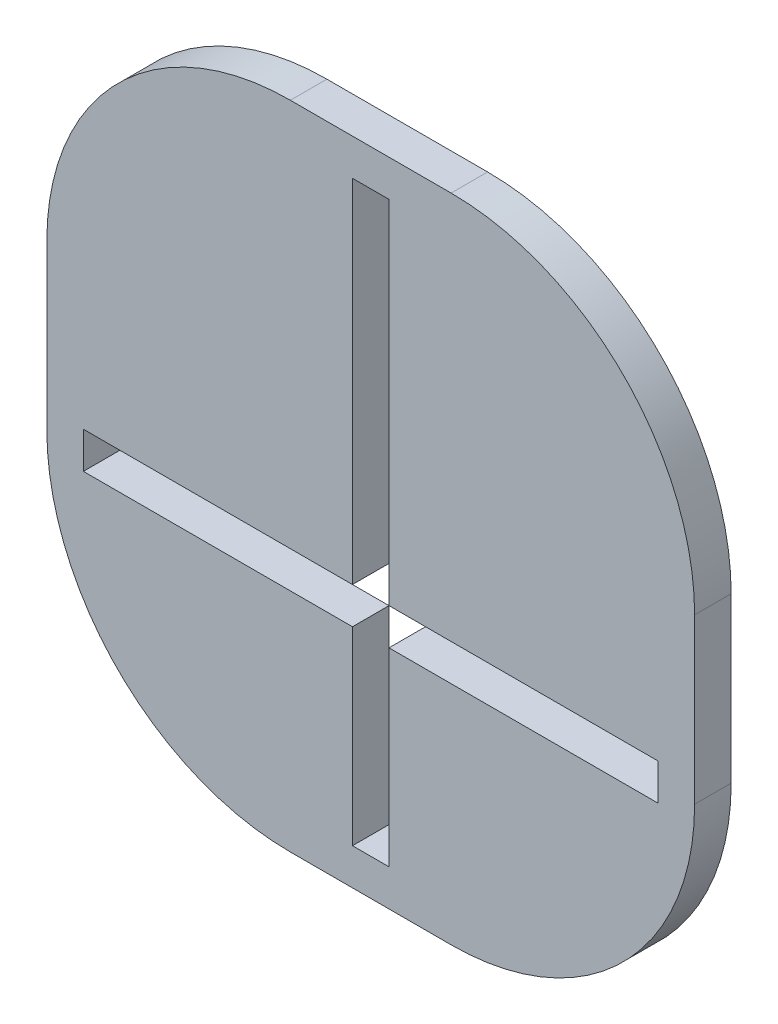
ISO-10303-21;
HEADER;
FILE_DESCRIPTION(('STEP AP214'),'2;1');
FILE_NAME('part.step','',(''),(''),'','','');
FILE_SCHEMA(('AUTOMOTIVE_DESIGN { 1 0 10303 214 1 1 1 1 }'));
ENDSEC;
DATA;
#1=APPLICATION_CONTEXT('core data for automotive mechanical design processes');
#2=APPLICATION_PROTOCOL_DEFINITION('international standard','automotive_design',2000,#1);
#3=PRODUCT_CONTEXT('',#1,'mechanical');
#4=PRODUCT('Part','Part','',(#3));
#5=PRODUCT_RELATED_PRODUCT_CATEGORY('part','',(#4));
#6=PRODUCT_DEFINITION_FORMATION('','',#4);
#7=PRODUCT_DEFINITION_CONTEXT('part definition',#1,'design');
#8=PRODUCT_DEFINITION('design','',#6,#7);
#9=PRODUCT_DEFINITION_SHAPE('','',#8);
#10=(LENGTH_UNIT() NAMED_UNIT(*) SI_UNIT(.MILLI.,.METRE.));
#11=(NAMED_UNIT(*) PLANE_ANGLE_UNIT() SI_UNIT($,.RADIAN.));
#12=(NAMED_UNIT(*) SI_UNIT($,.STERADIAN.) SOLID_ANGLE_UNIT());
#13=UNCERTAINTY_MEASURE_WITH_UNIT(LENGTH_MEASURE(1.E-05),#10,'distance_accuracy_value','');
#14=(GEOMETRIC_REPRESENTATION_CONTEXT(3) GLOBAL_UNCERTAINTY_ASSIGNED_CONTEXT((#13)) GLOBAL_UNIT_ASSIGNED_CONTEXT((#10,
#11,#12)) REPRESENTATION_CONTEXT('',''));
#15=CARTESIAN_POINT('',(0.,0.,0.));
#16=DIRECTION('',(0.,0.,1.));
#17=DIRECTION('',(1.,0.,0.));
#18=AXIS2_PLACEMENT_3D('',#15,#16,#17);
#19=CARTESIAN_POINT('',(0.,26.735,3.));
#20=DIRECTION('',(0.,-1.,0.));
#21=DIRECTION('',(1.,0.,0.));
#22=AXIS2_PLACEMENT_3D('',#19,#20,#21);
#23=PLANE('',#22);
#24=DIRECTION('',(-1.,0.,0.));
#25=VECTOR('',#24,1.);
#26=CARTESIAN_POINT('',(0.,26.735,0.));
#27=LINE('',#26,#25);
#28=CARTESIAN_POINT('',(6.6,26.735,0.));
#29=VERTEX_POINT('',#28);
#30=CARTESIAN_POINT('',(-6.60000000000003,26.735,0.));
#31=VERTEX_POINT('',#30);
#32=EDGE_CURVE('E254',#29,#31,#27,.T.);
#33=ORIENTED_EDGE('',*,*,#32,.T.);
#34=DIRECTION('',(0.,0.,-1.));
#35=VECTOR('',#34,1.);
#36=CARTESIAN_POINT('',(-6.60000000000003,26.735,3.));
#37=LINE('',#36,#35);
#38=CARTESIAN_POINT('',(-6.60000000000003,26.735,3.));
#39=VERTEX_POINT('',#38);
#40=EDGE_CURVE('E11',#39,#31,#37,.T.);
#41=ORIENTED_EDGE('',*,*,#40,.F.);
#42=DIRECTION('',(-1.,0.,0.));
#43=VECTOR('',#42,1.);
#44=CARTESIAN_POINT('',(0.,26.735,3.));
#45=LINE('',#44,#43);
#46=CARTESIAN_POINT('',(6.6,26.735,3.));
#47=VERTEX_POINT('',#46);
#48=EDGE_CURVE('E405',#47,#39,#45,.T.);
#49=ORIENTED_EDGE('',*,*,#48,.F.);
#50=DIRECTION('',(0.,0.,-1.));
#51=VECTOR('',#50,1.);
#52=CARTESIAN_POINT('',(6.6,26.735,3.));
#53=LINE('',#52,#51);
#54=EDGE_CURVE('E281',#47,#29,#53,.T.);
#55=ORIENTED_EDGE('',*,*,#54,.T.);
#56=EDGE_LOOP('',(#33,#41,#49,#55));
#57=FACE_BOUND('',#56,.T.);
#58=ADVANCED_FACE('F45',(#57),#23,.F.);
#59=CARTESIAN_POINT('',(-6.60000000000003,6.73500000000003,3.));
#60=DIRECTION('',(0.,0.,-1.));
#61=DIRECTION('',(-1.,0.,0.));
#62=AXIS2_PLACEMENT_3D('',#59,#60,#61);
#63=CYLINDRICAL_SURFACE('',#62,20.);
#64=CARTESIAN_POINT('',(-6.60000000000003,6.73500000000003,0.));
#65=DIRECTION('',(0.,0.,1.));
#66=DIRECTION('',(1.,0.,0.));
#67=AXIS2_PLACEMENT_3D('',#64,#65,#66);
#68=CIRCLE('',#67,20.);
#69=CARTESIAN_POINT('',(-26.6,6.73500000000002,0.));
#70=VERTEX_POINT('',#69);
#71=EDGE_CURVE('E258',#31,#70,#68,.T.);
#72=ORIENTED_EDGE('',*,*,#71,.T.);
#73=DIRECTION('',(0.,0.,-1.));
#74=VECTOR('',#73,1.);
#75=CARTESIAN_POINT('',(-26.6,6.73500000000002,3.));
#76=LINE('',#75,#74);
#77=CARTESIAN_POINT('',(-26.6,6.73500000000002,3.));
#78=VERTEX_POINT('',#77);
#79=EDGE_CURVE('E56',#78,#70,#76,.T.);
#80=ORIENTED_EDGE('',*,*,#79,.F.);
#81=CARTESIAN_POINT('',(-6.60000000000003,6.73500000000003,3.));
#82=DIRECTION('',(0.,0.,1.));
#83=DIRECTION('',(1.,0.,0.));
#84=AXIS2_PLACEMENT_3D('',#81,#82,#83);
#85=CIRCLE('',#84,20.);
#86=EDGE_CURVE('E408',#39,#78,#85,.T.);
#87=ORIENTED_EDGE('',*,*,#86,.F.);
#88=ORIENTED_EDGE('',*,*,#40,.T.);
#89=EDGE_LOOP('',(#72,#80,#87,#88));
#90=FACE_BOUND('',#89,.T.);
#91=ADVANCED_FACE('F440',(#90),#63,.T.);
#92=CARTESIAN_POINT('',(-26.6,0.,3.));
#93=DIRECTION('',(-1.,0.,0.));
#94=DIRECTION('',(0.,-1.,0.));
#95=AXIS2_PLACEMENT_3D('',#92,#93,#94);
#96=PLANE('',#95);
#97=DIRECTION('',(0.,1.,0.));
#98=VECTOR('',#97,1.);
#99=CARTESIAN_POINT('',(-26.6,0.,0.));
#100=LINE('',#99,#98);
#101=CARTESIAN_POINT('',(-26.6,-6.73500000000001,0.));
#102=VERTEX_POINT('',#101);
#103=EDGE_CURVE('E262',#102,#70,#100,.T.);
#104=ORIENTED_EDGE('',*,*,#103,.F.);
#105=DIRECTION('',(0.,0.,-1.));
#106=VECTOR('',#105,1.);
#107=CARTESIAN_POINT('',(-26.6,-6.73500000000001,3.));
#108=LINE('',#107,#106);
#109=CARTESIAN_POINT('',(-26.6,-6.73500000000001,3.));
#110=VERTEX_POINT('',#109);
#111=EDGE_CURVE('E291',#110,#102,#108,.T.);
#112=ORIENTED_EDGE('',*,*,#111,.F.);
#113=DIRECTION('',(0.,1.,0.));
#114=VECTOR('',#113,1.);
#115=CARTESIAN_POINT('',(-26.6,0.,3.));
#116=LINE('',#115,#114);
#117=EDGE_CURVE('E411',#110,#78,#116,.T.);
#118=ORIENTED_EDGE('',*,*,#117,.T.);
#119=ORIENTED_EDGE('',*,*,#79,.T.);
#120=EDGE_LOOP('',(#104,#112,#118,#119));
#121=FACE_BOUND('',#120,.T.);
#122=ADVANCED_FACE('F445',(#121),#96,.T.);
#123=CARTESIAN_POINT('',(-6.60000000000002,-6.735,3.));
#124=DIRECTION('',(0.,0.,-1.));
#125=DIRECTION('',(-1.,0.,0.));
#126=AXIS2_PLACEMENT_3D('',#123,#124,#125);
#127=CYLINDRICAL_SURFACE('',#126,20.);
#128=CARTESIAN_POINT('',(-6.60000000000002,-6.735,0.));
#129=DIRECTION('',(0.,0.,1.));
#130=DIRECTION('',(1.,0.,0.));
#131=AXIS2_PLACEMENT_3D('',#128,#129,#130);
#132=CIRCLE('',#131,20.);
#133=CARTESIAN_POINT('',(-6.60000000000002,-26.735,0.));
#134=VERTEX_POINT('',#133);
#135=EDGE_CURVE('E266',#134,#102,#132,.F.);
#136=ORIENTED_EDGE('',*,*,#135,.F.);
#137=DIRECTION('',(0.,0.,-1.));
#138=VECTOR('',#137,1.);
#139=CARTESIAN_POINT('',(-6.60000000000002,-26.735,3.));
#140=LINE('',#139,#138);
#141=CARTESIAN_POINT('',(-6.60000000000002,-26.735,3.));
#142=VERTEX_POINT('',#141);
#143=EDGE_CURVE('E288',#142,#134,#140,.T.);
#144=ORIENTED_EDGE('',*,*,#143,.F.);
#145=CARTESIAN_POINT('',(-6.60000000000002,-6.735,3.));
#146=DIRECTION('',(0.,0.,1.));
#147=DIRECTION('',(1.,0.,0.));
#148=AXIS2_PLACEMENT_3D('',#145,#146,#147);
#149=CIRCLE('',#148,20.);
#150=EDGE_CURVE('E415',#142,#110,#149,.F.);
#151=ORIENTED_EDGE('',*,*,#150,.T.);
#152=ORIENTED_EDGE('',*,*,#111,.T.);
#153=EDGE_LOOP('',(#136,#144,#151,#152));
#154=FACE_BOUND('',#153,.T.);
#155=ADVANCED_FACE('F608',(#154),#127,.T.);
#156=CARTESIAN_POINT('',(0.,-26.735,3.));
#157=DIRECTION('',(0.,-1.,0.));
#158=DIRECTION('',(1.,0.,0.));
#159=AXIS2_PLACEMENT_3D('',#156,#157,#158);
#160=PLANE('',#159);
#161=DIRECTION('',(-1.,0.,0.));
#162=VECTOR('',#161,1.);
#163=CARTESIAN_POINT('',(0.,-26.735,0.));
#164=LINE('',#163,#162);
#165=CARTESIAN_POINT('',(6.60000000000001,-26.735,0.));
#166=VERTEX_POINT('',#165);
#167=EDGE_CURVE('E270',#166,#134,#164,.T.);
#168=ORIENTED_EDGE('',*,*,#167,.F.);
#169=DIRECTION('',(0.,0.,-1.));
#170=VECTOR('',#169,1.);
#171=CARTESIAN_POINT('',(6.60000000000001,-26.735,3.));
#172=LINE('',#171,#170);
#173=CARTESIAN_POINT('',(6.60000000000001,-26.735,3.));
#174=VERTEX_POINT('',#173);
#175=EDGE_CURVE('E212',#174,#166,#172,.T.);
#176=ORIENTED_EDGE('',*,*,#175,.F.);
#177=DIRECTION('',(-1.,0.,0.));
#178=VECTOR('',#177,1.);
#179=CARTESIAN_POINT('',(0.,-26.735,3.));
#180=LINE('',#179,#178);
#181=EDGE_CURVE('E203',#174,#142,#180,.T.);
#182=ORIENTED_EDGE('',*,*,#181,.T.);
#183=ORIENTED_EDGE('',*,*,#143,.T.);
#184=EDGE_LOOP('',(#168,#176,#182,#183));
#185=FACE_BOUND('',#184,.T.);
#186=ADVANCED_FACE('F421',(#185),#160,.T.);
#187=CARTESIAN_POINT('',(6.6,-6.735,3.));
#188=DIRECTION('',(0.,0.,-1.));
#189=DIRECTION('',(-1.,0.,0.));
#190=AXIS2_PLACEMENT_3D('',#187,#188,#189);
#191=CYLINDRICAL_SURFACE('',#190,20.);
#192=CARTESIAN_POINT('',(6.6,-6.735,0.));
#193=DIRECTION('',(0.,0.,1.));
#194=DIRECTION('',(1.,0.,0.));
#195=AXIS2_PLACEMENT_3D('',#192,#193,#194);
#196=CIRCLE('',#195,20.);
#197=CARTESIAN_POINT('',(26.6,-6.735,0.));
#198=VERTEX_POINT('',#197);
#199=EDGE_CURVE('E210',#166,#198,#196,.T.);
#200=ORIENTED_EDGE('',*,*,#199,.T.);
#201=DIRECTION('',(0.,0.,-1.));
#202=VECTOR('',#201,1.);
#203=CARTESIAN_POINT('',(26.6,-6.735,3.));
#204=LINE('',#203,#202);
#205=CARTESIAN_POINT('',(26.6,-6.735,3.));
#206=VERTEX_POINT('',#205);
#207=EDGE_CURVE('E207',#206,#198,#204,.T.);
#208=ORIENTED_EDGE('',*,*,#207,.F.);
#209=CARTESIAN_POINT('',(6.6,-6.735,3.));
#210=DIRECTION('',(0.,0.,1.));
#211=DIRECTION('',(1.,0.,0.));
#212=AXIS2_PLACEMENT_3D('',#209,#210,#211);
#213=CIRCLE('',#212,20.);
#214=EDGE_CURVE('E196',#174,#206,#213,.T.);
#215=ORIENTED_EDGE('',*,*,#214,.F.);
#216=ORIENTED_EDGE('',*,*,#175,.T.);
#217=EDGE_LOOP('',(#200,#208,#215,#216));
#218=FACE_BOUND('',#217,.T.);
#219=ADVANCED_FACE('F208',(#218),#191,.T.);
#220=CARTESIAN_POINT('',(26.6,0.,3.));
#221=DIRECTION('',(-1.,0.,0.));
#222=DIRECTION('',(0.,0.,1.));
#223=AXIS2_PLACEMENT_3D('',#220,#221,#222);
#224=PLANE('',#223);
#225=DIRECTION('',(0.,1.,0.));
#226=VECTOR('',#225,1.);
#227=CARTESIAN_POINT('',(26.6,0.,0.));
#228=LINE('',#227,#226);
#229=CARTESIAN_POINT('',(26.6,6.73500000000003,0.));
#230=VERTEX_POINT('',#229);
#231=EDGE_CURVE('E130',#198,#230,#228,.T.);
#232=ORIENTED_EDGE('',*,*,#231,.T.);
#233=DIRECTION('',(0.,0.,-1.));
#234=VECTOR('',#233,1.);
#235=CARTESIAN_POINT('',(26.6,6.73500000000003,3.));
#236=LINE('',#235,#234);
#237=CARTESIAN_POINT('',(26.6,6.73500000000003,3.));
#238=VERTEX_POINT('',#237);
#239=EDGE_CURVE('E213',#238,#230,#236,.T.);
#240=ORIENTED_EDGE('',*,*,#239,.F.);
#241=DIRECTION('',(0.,1.,0.));
#242=VECTOR('',#241,1.);
#243=CARTESIAN_POINT('',(26.6,0.,3.));
#244=LINE('',#243,#242);
#245=EDGE_CURVE('E200',#206,#238,#244,.T.);
#246=ORIENTED_EDGE('',*,*,#245,.F.);
#247=ORIENTED_EDGE('',*,*,#207,.T.);
#248=EDGE_LOOP('',(#232,#240,#246,#247));
#249=FACE_BOUND('',#248,.T.);
#250=ADVANCED_FACE('F215',(#249),#224,.F.);
#251=CARTESIAN_POINT('',(0.,23.735,3.));
#252=DIRECTION('',(0.,1.,0.));
#253=DIRECTION('',(0.,0.,1.));
#254=AXIS2_PLACEMENT_3D('',#251,#252,#253);
#255=PLANE('',#254);
#256=DIRECTION('',(1.,0.,0.));
#257=VECTOR('',#256,1.);
#258=CARTESIAN_POINT('',(0.,23.735,0.));
#259=LINE('',#258,#257);
#260=CARTESIAN_POINT('',(-1.50000000000001,23.735,0.));
#261=VERTEX_POINT('',#260);
#262=CARTESIAN_POINT('',(1.50000000000001,23.735,0.));
#263=VERTEX_POINT('',#262);
#264=EDGE_CURVE('E223',#261,#263,#259,.T.);
#265=ORIENTED_EDGE('',*,*,#264,.T.);
#266=DIRECTION('',(0.,0.,-1.));
#267=VECTOR('',#266,1.);
#268=CARTESIAN_POINT('',(1.50000000000001,23.735,3.));
#269=LINE('',#268,#267);
#270=CARTESIAN_POINT('',(1.50000000000001,23.735,3.));
#271=VERTEX_POINT('',#270);
#272=EDGE_CURVE('E49',#271,#263,#269,.T.);
#273=ORIENTED_EDGE('',*,*,#272,.F.);
#274=DIRECTION('',(1.,0.,0.));
#275=VECTOR('',#274,1.);
#276=CARTESIAN_POINT('',(0.,23.735,3.));
#277=LINE('',#276,#275);
#278=CARTESIAN_POINT('',(-1.50000000000001,23.735,3.));
#279=VERTEX_POINT('',#278);
#280=EDGE_CURVE('E280',#279,#271,#277,.T.);
#281=ORIENTED_EDGE('',*,*,#280,.F.);
#282=DIRECTION('',(0.,0.,-1.));
#283=VECTOR('',#282,1.);
#284=CARTESIAN_POINT('',(-1.50000000000001,23.735,3.));
#285=LINE('',#284,#283);
#286=EDGE_CURVE('E219',#279,#261,#285,.T.);
#287=ORIENTED_EDGE('',*,*,#286,.T.);
#288=EDGE_LOOP('',(#265,#273,#281,#287));
#289=FACE_BOUND('',#288,.T.);
#290=ADVANCED_FACE('F47',(#289),#255,.F.);
#291=CARTESIAN_POINT('',(1.50000000000001,0.,3.));
#292=DIRECTION('',(1.,0.,0.));
#293=DIRECTION('',(0.,0.,-1.));
#294=AXIS2_PLACEMENT_3D('',#291,#292,#293);
#295=PLANE('',#294);
#296=DIRECTION('',(0.,-1.,0.));
#297=VECTOR('',#296,1.);
#298=CARTESIAN_POINT('',(1.50000000000001,0.,0.));
#299=LINE('',#298,#297);
#300=CARTESIAN_POINT('',(1.50000000000001,-5.16,0.));
#301=VERTEX_POINT('',#300);
#302=EDGE_CURVE('E227',#263,#301,#299,.T.);
#303=ORIENTED_EDGE('',*,*,#302,.T.);
#304=DIRECTION('',(0.,0.,-1.));
#305=VECTOR('',#304,1.);
#306=CARTESIAN_POINT('',(1.50000000000001,-5.16,3.));
#307=LINE('',#306,#305);
#308=CARTESIAN_POINT('',(1.50000000000001,-5.16,3.));
#309=VERTEX_POINT('',#308);
#310=EDGE_CURVE('E329',#309,#301,#307,.T.);
#311=ORIENTED_EDGE('',*,*,#310,.F.);
#312=DIRECTION('',(0.,-1.,0.));
#313=VECTOR('',#312,1.);
#314=CARTESIAN_POINT('',(1.50000000000001,0.,3.));
#315=LINE('',#314,#313);
#316=EDGE_CURVE('E145',#271,#309,#315,.T.);
#317=ORIENTED_EDGE('',*,*,#316,.F.);
#318=ORIENTED_EDGE('',*,*,#272,.T.);
#319=EDGE_LOOP('',(#303,#311,#317,#318));
#320=FACE_BOUND('',#319,.T.);
#321=ADVANCED_FACE('F337',(#320),#295,.F.);
#322=CARTESIAN_POINT('',(0.,-5.16,3.));
#323=DIRECTION('',(0.,1.,0.));
#324=DIRECTION('',(0.,0.,1.));
#325=AXIS2_PLACEMENT_3D('',#322,#323,#324);
#326=PLANE('',#325);
#327=DIRECTION('',(1.,0.,0.));
#328=VECTOR('',#327,1.);
#329=CARTESIAN_POINT('',(0.,-5.16,0.));
#330=LINE('',#329,#328);
#331=CARTESIAN_POINT('',(23.6,-5.16,0.));
#332=VERTEX_POINT('',#331);
#333=EDGE_CURVE('E230',#301,#332,#330,.T.);
#334=ORIENTED_EDGE('',*,*,#333,.T.);
#335=DIRECTION('',(0.,0.,-1.));
#336=VECTOR('',#335,1.);
#337=CARTESIAN_POINT('',(23.6,-5.16,3.));
#338=LINE('',#337,#336);
#339=CARTESIAN_POINT('',(23.6,-5.16,3.));
#340=VERTEX_POINT('',#339);
#341=EDGE_CURVE('E326',#340,#332,#338,.T.);
#342=ORIENTED_EDGE('',*,*,#341,.F.);
#343=DIRECTION('',(1.,0.,0.));
#344=VECTOR('',#343,1.);
#345=CARTESIAN_POINT('',(0.,-5.16,3.));
#346=LINE('',#345,#344);
#347=EDGE_CURVE('E477',#309,#340,#346,.T.);
#348=ORIENTED_EDGE('',*,*,#347,.F.);
#349=ORIENTED_EDGE('',*,*,#310,.T.);
#350=EDGE_LOOP('',(#334,#342,#348,#349));
#351=FACE_BOUND('',#350,.T.);
#352=ADVANCED_FACE('F452',(#351),#326,.F.);
#353=CARTESIAN_POINT('',(23.6,0.,3.));
#354=DIRECTION('',(1.,0.,0.));
#355=DIRECTION('',(0.,0.,-1.));
#356=AXIS2_PLACEMENT_3D('',#353,#354,#355);
#357=PLANE('',#356);
#358=DIRECTION('',(0.,-1.,0.));
#359=VECTOR('',#358,1.);
#360=CARTESIAN_POINT('',(23.6,0.,0.));
#361=LINE('',#360,#359);
#362=CARTESIAN_POINT('',(23.6,-8.16000000000001,0.));
#363=VERTEX_POINT('',#362);
#364=EDGE_CURVE('E234',#332,#363,#361,.T.);
#365=ORIENTED_EDGE('',*,*,#364,.T.);
#366=DIRECTION('',(0.,0.,-1.));
#367=VECTOR('',#366,1.);
#368=CARTESIAN_POINT('',(23.6,-8.16000000000001,3.));
#369=LINE('',#368,#367);
#370=CARTESIAN_POINT('',(23.6,-8.16000000000001,3.));
#371=VERTEX_POINT('',#370);
#372=EDGE_CURVE('E322',#371,#363,#369,.T.);
#373=ORIENTED_EDGE('',*,*,#372,.F.);
#374=DIRECTION('',(0.,-1.,0.));
#375=VECTOR('',#374,1.);
#376=CARTESIAN_POINT('',(23.6,0.,3.));
#377=LINE('',#376,#375);
#378=EDGE_CURVE('E475',#340,#371,#377,.T.);
#379=ORIENTED_EDGE('',*,*,#378,.F.);
#380=ORIENTED_EDGE('',*,*,#341,.T.);
#381=EDGE_LOOP('',(#365,#373,#379,#380));
#382=FACE_BOUND('',#381,.T.);
#383=ADVANCED_FACE('F461',(#382),#357,.F.);
#384=CARTESIAN_POINT('',(0.,-8.16000000000001,3.));
#385=DIRECTION('',(0.,-1.,0.));
#386=DIRECTION('',(0.,0.,-1.));
#387=AXIS2_PLACEMENT_3D('',#384,#385,#386);
#388=PLANE('',#387);
#389=DIRECTION('',(-1.,0.,0.));
#390=VECTOR('',#389,1.);
#391=CARTESIAN_POINT('',(0.,-8.16000000000001,0.));
#392=LINE('',#391,#390);
#393=CARTESIAN_POINT('',(1.50000000000001,-8.16000000000001,0.));
#394=VERTEX_POINT('',#393);
#395=EDGE_CURVE('E238',#363,#394,#392,.T.);
#396=ORIENTED_EDGE('',*,*,#395,.T.);
#397=DIRECTION('',(0.,0.,-1.));
#398=VECTOR('',#397,1.);
#399=CARTESIAN_POINT('',(1.50000000000001,-8.16000000000001,3.));
#400=LINE('',#399,#398);
#401=CARTESIAN_POINT('',(1.50000000000001,-8.16000000000001,3.));
#402=VERTEX_POINT('',#401);
#403=EDGE_CURVE('E318',#402,#394,#400,.T.);
#404=ORIENTED_EDGE('',*,*,#403,.F.);
#405=DIRECTION('',(-1.,0.,0.));
#406=VECTOR('',#405,1.);
#407=CARTESIAN_POINT('',(0.,-8.16000000000001,3.));
#408=LINE('',#407,#406);
#409=EDGE_CURVE('E397',#371,#402,#408,.T.);
#410=ORIENTED_EDGE('',*,*,#409,.F.);
#411=ORIENTED_EDGE('',*,*,#372,.T.);
#412=EDGE_LOOP('',(#396,#404,#410,#411));
#413=FACE_BOUND('',#412,.T.);
#414=ADVANCED_FACE('F457',(#413),#388,.F.);
#415=CARTESIAN_POINT('',(1.50000000000001,-23.735,0.));
#416=VERTEX_POINT('',#415);
#417=EDGE_CURVE('E231',#394,#416,#299,.T.);
#418=ORIENTED_EDGE('',*,*,#417,.T.);
#419=DIRECTION('',(0.,0.,-1.));
#420=VECTOR('',#419,1.);
#421=CARTESIAN_POINT('',(1.50000000000001,-23.735,3.));
#422=LINE('',#421,#420);
#423=CARTESIAN_POINT('',(1.50000000000001,-23.735,3.));
#424=VERTEX_POINT('',#423);
#425=EDGE_CURVE('E315',#424,#416,#422,.T.);
#426=ORIENTED_EDGE('',*,*,#425,.F.);
#427=EDGE_CURVE('E391',#402,#424,#315,.T.);
#428=ORIENTED_EDGE('',*,*,#427,.F.);
#429=ORIENTED_EDGE('',*,*,#403,.T.);
#430=EDGE_LOOP('',(#418,#426,#428,#429));
#431=FACE_BOUND('',#430,.T.);
#432=ADVANCED_FACE('F377',(#431),#295,.F.);
#433=CARTESIAN_POINT('',(0.,-23.735,3.));
#434=DIRECTION('',(0.,1.,0.));
#435=DIRECTION('',(0.,0.,1.));
#436=AXIS2_PLACEMENT_3D('',#433,#434,#435);
#437=PLANE('',#436);
#438=DIRECTION('',(1.,0.,0.));
#439=VECTOR('',#438,1.);
#440=CARTESIAN_POINT('',(0.,-23.735,0.));
#441=LINE('',#440,#439);
#442=CARTESIAN_POINT('',(-1.50000000000001,-23.735,0.));
#443=VERTEX_POINT('',#442);
#444=EDGE_CURVE('E242',#443,#416,#441,.T.);
#445=ORIENTED_EDGE('',*,*,#444,.F.);
#446=DIRECTION('',(0.,0.,-1.));
#447=VECTOR('',#446,1.);
#448=CARTESIAN_POINT('',(-1.50000000000001,-23.735,3.));
#449=LINE('',#448,#447);
#450=CARTESIAN_POINT('',(-1.50000000000001,-23.735,3.));
#451=VERTEX_POINT('',#450);
#452=EDGE_CURVE('E312',#451,#443,#449,.T.);
#453=ORIENTED_EDGE('',*,*,#452,.F.);
#454=DIRECTION('',(1.,0.,0.));
#455=VECTOR('',#454,1.);
#456=CARTESIAN_POINT('',(0.,-23.735,3.));
#457=LINE('',#456,#455);
#458=EDGE_CURVE('E386',#451,#424,#457,.T.);
#459=ORIENTED_EDGE('',*,*,#458,.T.);
#460=ORIENTED_EDGE('',*,*,#425,.T.);
#461=EDGE_LOOP('',(#445,#453,#459,#460));
#462=FACE_BOUND('',#461,.T.);
#463=ADVANCED_FACE('F384',(#462),#437,.T.);
#464=CARTESIAN_POINT('',(-1.50000000000001,0.,3.));
#465=DIRECTION('',(1.,0.,0.));
#466=DIRECTION('',(0.,0.,-1.));
#467=AXIS2_PLACEMENT_3D('',#464,#465,#466);
#468=PLANE('',#467);
#469=DIRECTION('',(0.,-1.,0.));
#470=VECTOR('',#469,1.);
#471=CARTESIAN_POINT('',(-1.50000000000001,0.,0.));
#472=LINE('',#471,#470);
#473=CARTESIAN_POINT('',(-1.50000000000001,-8.16000000000001,0.));
#474=VERTEX_POINT('',#473);
#475=EDGE_CURVE('E246',#474,#443,#472,.T.);
#476=ORIENTED_EDGE('',*,*,#475,.F.);
#477=DIRECTION('',(0.,0.,-1.));
#478=VECTOR('',#477,1.);
#479=CARTESIAN_POINT('',(-1.50000000000001,-8.16000000000001,3.));
#480=LINE('',#479,#478);
#481=CARTESIAN_POINT('',(-1.50000000000001,-8.16000000000001,3.));
#482=VERTEX_POINT('',#481);
#483=EDGE_CURVE('E309',#482,#474,#480,.T.);
#484=ORIENTED_EDGE('',*,*,#483,.F.);
#485=DIRECTION('',(0.,-1.,0.));
#486=VECTOR('',#485,1.);
#487=CARTESIAN_POINT('',(-1.50000000000001,0.,3.));
#488=LINE('',#487,#486);
#489=EDGE_CURVE('E390',#482,#451,#488,.T.);
#490=ORIENTED_EDGE('',*,*,#489,.T.);
#491=ORIENTED_EDGE('',*,*,#452,.T.);
#492=EDGE_LOOP('',(#476,#484,#490,#491));
#493=FACE_BOUND('',#492,.T.);
#494=ADVANCED_FACE('F436',(#493),#468,.T.);
#495=CARTESIAN_POINT('',(-23.6,-8.16000000000001,0.));
#496=VERTEX_POINT('',#495);
#497=EDGE_CURVE('E241',#474,#496,#392,.T.);
#498=ORIENTED_EDGE('',*,*,#497,.T.);
#499=DIRECTION('',(0.,0.,-1.));
#500=VECTOR('',#499,1.);
#501=CARTESIAN_POINT('',(-23.6,-8.16000000000001,3.));
#502=LINE('',#501,#500);
#503=CARTESIAN_POINT('',(-23.6,-8.16000000000001,3.));
#504=VERTEX_POINT('',#503);
#505=EDGE_CURVE('E305',#504,#496,#502,.T.);
#506=ORIENTED_EDGE('',*,*,#505,.F.);
#507=EDGE_CURVE('E369',#482,#504,#408,.T.);
#508=ORIENTED_EDGE('',*,*,#507,.F.);
#509=ORIENTED_EDGE('',*,*,#483,.T.);
#510=EDGE_LOOP('',(#498,#506,#508,#509));
#511=FACE_BOUND('',#510,.T.);
#512=ADVANCED_FACE('F368',(#511),#388,.F.);
#513=CARTESIAN_POINT('',(-23.6,0.,3.));
#514=DIRECTION('',(-1.,0.,0.));
#515=DIRECTION('',(0.,0.,1.));
#516=AXIS2_PLACEMENT_3D('',#513,#514,#515);
#517=PLANE('',#516);
#518=DIRECTION('',(0.,1.,0.));
#519=VECTOR('',#518,1.);
#520=CARTESIAN_POINT('',(-23.6,0.,0.));
#521=LINE('',#520,#519);
#522=CARTESIAN_POINT('',(-23.6,-5.16,0.));
#523=VERTEX_POINT('',#522);
#524=EDGE_CURVE('E251',#496,#523,#521,.T.);
#525=ORIENTED_EDGE('',*,*,#524,.T.);
#526=DIRECTION('',(0.,0.,-1.));
#527=VECTOR('',#526,1.);
#528=CARTESIAN_POINT('',(-23.6,-5.16,3.));
#529=LINE('',#528,#527);
#530=CARTESIAN_POINT('',(-23.6,-5.16,3.));
#531=VERTEX_POINT('',#530);
#532=EDGE_CURVE('E301',#531,#523,#529,.T.);
#533=ORIENTED_EDGE('',*,*,#532,.F.);
#534=DIRECTION('',(0.,1.,0.));
#535=VECTOR('',#534,1.);
#536=CARTESIAN_POINT('',(-23.6,0.,3.));
#537=LINE('',#536,#535);
#538=EDGE_CURVE('E365',#504,#531,#537,.T.);
#539=ORIENTED_EDGE('',*,*,#538,.F.);
#540=ORIENTED_EDGE('',*,*,#505,.T.);
#541=EDGE_LOOP('',(#525,#533,#539,#540));
#542=FACE_BOUND('',#541,.T.);
#543=ADVANCED_FACE('F362',(#542),#517,.F.);
#544=CARTESIAN_POINT('',(-1.50000000000001,-5.16,0.));
#545=VERTEX_POINT('',#544);
#546=EDGE_CURVE('E235',#523,#545,#330,.T.);
#547=ORIENTED_EDGE('',*,*,#546,.T.);
#548=DIRECTION('',(0.,0.,-1.));
#549=VECTOR('',#548,1.);
#550=CARTESIAN_POINT('',(-1.50000000000001,-5.16,3.));
#551=LINE('',#550,#549);
#552=CARTESIAN_POINT('',(-1.50000000000001,-5.16,3.));
#553=VERTEX_POINT('',#552);
#554=EDGE_CURVE('E298',#553,#545,#551,.T.);
#555=ORIENTED_EDGE('',*,*,#554,.F.);
#556=EDGE_CURVE('E404',#531,#553,#346,.T.);
#557=ORIENTED_EDGE('',*,*,#556,.F.);
#558=ORIENTED_EDGE('',*,*,#532,.T.);
#559=EDGE_LOOP('',(#547,#555,#557,#558));
#560=FACE_BOUND('',#559,.T.);
#561=ADVANCED_FACE('F355',(#560),#326,.F.);
#562=EDGE_CURVE('E250',#261,#545,#472,.T.);
#563=ORIENTED_EDGE('',*,*,#562,.F.);
#564=ORIENTED_EDGE('',*,*,#286,.F.);
#565=EDGE_CURVE('E396',#279,#553,#488,.T.);
#566=ORIENTED_EDGE('',*,*,#565,.T.);
#567=ORIENTED_EDGE('',*,*,#554,.T.);
#568=EDGE_LOOP('',(#563,#564,#566,#567));
#569=FACE_BOUND('',#568,.T.);
#570=ADVANCED_FACE('F348',(#569),#468,.T.);
#571=CARTESIAN_POINT('',(6.6,6.73500000000003,3.));
#572=DIRECTION('',(0.,0.,-1.));
#573=DIRECTION('',(-1.,0.,0.));
#574=AXIS2_PLACEMENT_3D('',#571,#572,#573);
#575=CYLINDRICAL_SURFACE('',#574,20.);
#576=CARTESIAN_POINT('',(6.6,6.73500000000003,0.));
#577=DIRECTION('',(0.,0.,1.));
#578=DIRECTION('',(1.,0.,0.));
#579=AXIS2_PLACEMENT_3D('',#576,#577,#578);
#580=CIRCLE('',#579,20.);
#581=EDGE_CURVE('E136',#230,#29,#580,.T.);
#582=ORIENTED_EDGE('',*,*,#581,.T.);
#583=ORIENTED_EDGE('',*,*,#54,.F.);
#584=CARTESIAN_POINT('',(6.6,6.73500000000003,3.));
#585=DIRECTION('',(0.,0.,1.));
#586=DIRECTION('',(1.,0.,0.));
#587=AXIS2_PLACEMENT_3D('',#584,#585,#586);
#588=CIRCLE('',#587,20.);
#589=EDGE_CURVE('E65',#238,#47,#588,.T.);
#590=ORIENTED_EDGE('',*,*,#589,.F.);
#591=ORIENTED_EDGE('',*,*,#239,.T.);
#592=EDGE_LOOP('',(#582,#583,#590,#591));
#593=FACE_BOUND('',#592,.T.);
#594=ADVANCED_FACE('F427',(#593),#575,.T.);
#595=CARTESIAN_POINT('',(0.,0.,3.));
#596=DIRECTION('',(0.,0.,1.));
#597=DIRECTION('',(1.,0.,0.));
#598=AXIS2_PLACEMENT_3D('',#595,#596,#597);
#599=PLANE('',#598);
#600=ORIENTED_EDGE('',*,*,#280,.T.);
#601=ORIENTED_EDGE('',*,*,#316,.T.);
#602=ORIENTED_EDGE('',*,*,#347,.T.);
#603=ORIENTED_EDGE('',*,*,#378,.T.);
#604=ORIENTED_EDGE('',*,*,#409,.T.);
#605=ORIENTED_EDGE('',*,*,#427,.T.);
#606=ORIENTED_EDGE('',*,*,#458,.F.);
#607=ORIENTED_EDGE('',*,*,#489,.F.);
#608=ORIENTED_EDGE('',*,*,#507,.T.);
#609=ORIENTED_EDGE('',*,*,#538,.T.);
#610=ORIENTED_EDGE('',*,*,#556,.T.);
#611=ORIENTED_EDGE('',*,*,#565,.F.);
#612=EDGE_LOOP('',(#600,#601,#602,#603,#604,#605,#606,#607,#608,#609,#610,#611));
#613=FACE_BOUND('',#612,.T.);
#614=ORIENTED_EDGE('',*,*,#48,.T.);
#615=ORIENTED_EDGE('',*,*,#86,.T.);
#616=ORIENTED_EDGE('',*,*,#117,.F.);
#617=ORIENTED_EDGE('',*,*,#150,.F.);
#618=ORIENTED_EDGE('',*,*,#181,.F.);
#619=ORIENTED_EDGE('',*,*,#214,.T.);
#620=ORIENTED_EDGE('',*,*,#245,.T.);
#621=ORIENTED_EDGE('',*,*,#589,.T.);
#622=EDGE_LOOP('',(#614,#615,#616,#617,#618,#619,#620,#621));
#623=FACE_BOUND('',#622,.T.);
#624=ADVANCED_FACE('F198',(#613,#623),#599,.T.);
#625=CARTESIAN_POINT('',(0.,0.,0.));
#626=DIRECTION('',(0.,0.,1.));
#627=DIRECTION('',(1.,0.,0.));
#628=AXIS2_PLACEMENT_3D('',#625,#626,#627);
#629=PLANE('',#628);
#630=ORIENTED_EDGE('',*,*,#264,.F.);
#631=ORIENTED_EDGE('',*,*,#562,.T.);
#632=ORIENTED_EDGE('',*,*,#546,.F.);
#633=ORIENTED_EDGE('',*,*,#524,.F.);
#634=ORIENTED_EDGE('',*,*,#497,.F.);
#635=ORIENTED_EDGE('',*,*,#475,.T.);
#636=ORIENTED_EDGE('',*,*,#444,.T.);
#637=ORIENTED_EDGE('',*,*,#417,.F.);
#638=ORIENTED_EDGE('',*,*,#395,.F.);
#639=ORIENTED_EDGE('',*,*,#364,.F.);
#640=ORIENTED_EDGE('',*,*,#333,.F.);
#641=ORIENTED_EDGE('',*,*,#302,.F.);
#642=EDGE_LOOP('',(#630,#631,#632,#633,#634,#635,#636,#637,#638,#639,#640,#641));
#643=FACE_BOUND('',#642,.T.);
#644=ORIENTED_EDGE('',*,*,#32,.F.);
#645=ORIENTED_EDGE('',*,*,#581,.F.);
#646=ORIENTED_EDGE('',*,*,#231,.F.);
#647=ORIENTED_EDGE('',*,*,#199,.F.);
#648=ORIENTED_EDGE('',*,*,#167,.T.);
#649=ORIENTED_EDGE('',*,*,#135,.T.);
#650=ORIENTED_EDGE('',*,*,#103,.T.);
#651=ORIENTED_EDGE('',*,*,#71,.F.);
#652=EDGE_LOOP('',(#644,#645,#646,#647,#648,#649,#650,#651));
#653=FACE_BOUND('',#652,.T.);
#654=ADVANCED_FACE('F344',(#643,#653),#629,.F.);
#655=CLOSED_SHELL('',(#58,#91,#122,#155,#186,#219,#250,#290,#321,#352,#383,#414,#432,#463,#494,
#512,#543,#561,#570,#594,#624,#654));
#656=MANIFOLD_SOLID_BREP('B2',#655);
#657=ADVANCED_BREP_SHAPE_REPRESENTATION('',(#18,#656),#14);
#658=SHAPE_DEFINITION_REPRESENTATION(#9,#657);
ENDSEC;
END-ISO-10303-21;
